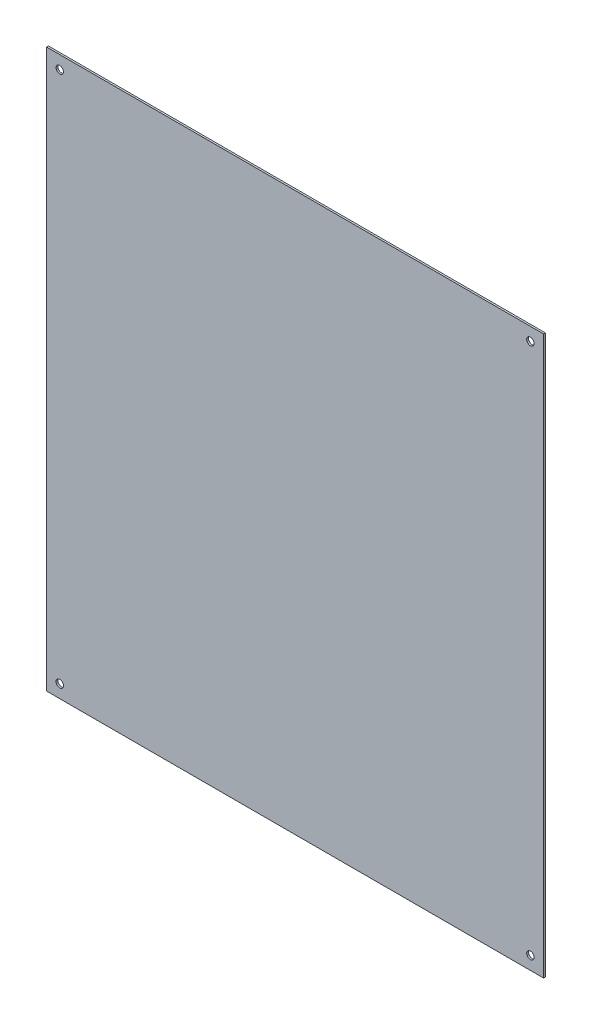
ISO-10303-21;
HEADER;
FILE_DESCRIPTION(('STEP AP214'),'2;1');
FILE_NAME('part.step','',(''),(''),'','','');
FILE_SCHEMA(('AUTOMOTIVE_DESIGN { 1 0 10303 214 1 1 1 1 }'));
ENDSEC;
DATA;
#1=APPLICATION_CONTEXT('core data for automotive mechanical design processes');
#2=APPLICATION_PROTOCOL_DEFINITION('international standard','automotive_design',2000,#1);
#3=PRODUCT_CONTEXT('',#1,'mechanical');
#4=PRODUCT('Part','Part','',(#3));
#5=PRODUCT_RELATED_PRODUCT_CATEGORY('part','',(#4));
#6=PRODUCT_DEFINITION_FORMATION('','',#4);
#7=PRODUCT_DEFINITION_CONTEXT('part definition',#1,'design');
#8=PRODUCT_DEFINITION('design','',#6,#7);
#9=PRODUCT_DEFINITION_SHAPE('','',#8);
#10=(LENGTH_UNIT() NAMED_UNIT(*) SI_UNIT(.MILLI.,.METRE.));
#11=(NAMED_UNIT(*) PLANE_ANGLE_UNIT() SI_UNIT($,.RADIAN.));
#12=(NAMED_UNIT(*) SI_UNIT($,.STERADIAN.) SOLID_ANGLE_UNIT());
#13=UNCERTAINTY_MEASURE_WITH_UNIT(LENGTH_MEASURE(1.E-05),#10,'distance_accuracy_value','');
#14=(GEOMETRIC_REPRESENTATION_CONTEXT(3) GLOBAL_UNCERTAINTY_ASSIGNED_CONTEXT((#13)) GLOBAL_UNIT_ASSIGNED_CONTEXT((#10,
#11,#12)) REPRESENTATION_CONTEXT('',''));
#15=CARTESIAN_POINT('',(0.,0.,0.));
#16=DIRECTION('',(0.,0.,1.));
#17=DIRECTION('',(1.,0.,0.));
#18=AXIS2_PLACEMENT_3D('',#15,#16,#17);
#19=CARTESIAN_POINT('',(-361.95,-406.4,11.557));
#20=DIRECTION('',(0.,0.,1.));
#21=DIRECTION('',(1.,0.,0.));
#22=AXIS2_PLACEMENT_3D('',#19,#20,#21);
#23=PLANE('',#22);
#24=CARTESIAN_POINT('',(-342.9,387.35,11.557));
#25=DIRECTION('',(0.,0.,1.));
#26=DIRECTION('',(1.,0.,0.));
#27=AXIS2_PLACEMENT_3D('',#24,#25,#26);
#28=CIRCLE('',#27,5.39750000000004);
#29=CARTESIAN_POINT('',(-337.5025,387.35,11.557));
#30=VERTEX_POINT('',#29);
#31=EDGE_CURVE('E91',#30,#30,#28,.T.);
#32=ORIENTED_EDGE('',*,*,#31,.T.);
#33=EDGE_LOOP('',(#32));
#34=FACE_BOUND('',#33,.T.);
#35=CARTESIAN_POINT('',(342.9,387.35,11.557));
#36=DIRECTION('',(0.,0.,1.));
#37=DIRECTION('',(1.,0.,0.));
#38=AXIS2_PLACEMENT_3D('',#35,#36,#37);
#39=CIRCLE('',#38,5.39750000000004);
#40=CARTESIAN_POINT('',(348.2975,387.35,11.557));
#41=VERTEX_POINT('',#40);
#42=EDGE_CURVE('E95',#41,#41,#39,.T.);
#43=ORIENTED_EDGE('',*,*,#42,.T.);
#44=EDGE_LOOP('',(#43));
#45=FACE_BOUND('',#44,.T.);
#46=CARTESIAN_POINT('',(342.9,-387.35,11.557));
#47=DIRECTION('',(0.,0.,1.));
#48=DIRECTION('',(1.,0.,0.));
#49=AXIS2_PLACEMENT_3D('',#46,#47,#48);
#50=CIRCLE('',#49,5.39750000000004);
#51=CARTESIAN_POINT('',(348.2975,-387.35,11.557));
#52=VERTEX_POINT('',#51);
#53=EDGE_CURVE('E97',#52,#52,#50,.T.);
#54=ORIENTED_EDGE('',*,*,#53,.T.);
#55=EDGE_LOOP('',(#54));
#56=FACE_BOUND('',#55,.T.);
#57=CARTESIAN_POINT('',(-342.9,-387.35,11.557));
#58=DIRECTION('',(0.,0.,1.));
#59=DIRECTION('',(1.,0.,0.));
#60=AXIS2_PLACEMENT_3D('',#57,#58,#59);
#61=CIRCLE('',#60,5.39750000000004);
#62=CARTESIAN_POINT('',(-337.5025,-387.35,11.557));
#63=VERTEX_POINT('',#62);
#64=EDGE_CURVE('E20',#63,#63,#61,.T.);
#65=ORIENTED_EDGE('',*,*,#64,.T.);
#66=EDGE_LOOP('',(#65));
#67=FACE_BOUND('',#66,.T.);
#68=DIRECTION('',(0.,1.,0.));
#69=VECTOR('',#68,1.);
#70=CARTESIAN_POINT('',(361.95,406.4,11.557));
#71=LINE('',#70,#69);
#72=CARTESIAN_POINT('',(361.95,406.4,11.557));
#73=VERTEX_POINT('',#72);
#74=CARTESIAN_POINT('',(361.95,-406.4,11.557));
#75=VERTEX_POINT('',#74);
#76=EDGE_CURVE('E57',#73,#75,#71,.F.);
#77=ORIENTED_EDGE('',*,*,#76,.T.);
#78=DIRECTION('',(1.,0.,0.));
#79=VECTOR('',#78,1.);
#80=CARTESIAN_POINT('',(-361.95,-406.4,11.557));
#81=LINE('',#80,#79);
#82=CARTESIAN_POINT('',(-361.95,-406.4,11.557));
#83=VERTEX_POINT('',#82);
#84=EDGE_CURVE('E59',#75,#83,#81,.F.);
#85=ORIENTED_EDGE('',*,*,#84,.T.);
#86=DIRECTION('',(0.,1.,0.));
#87=VECTOR('',#86,1.);
#88=CARTESIAN_POINT('',(-361.95,406.4,11.557));
#89=LINE('',#88,#87);
#90=CARTESIAN_POINT('',(-361.95,406.4,11.557));
#91=VERTEX_POINT('',#90);
#92=EDGE_CURVE('E105',#83,#91,#89,.T.);
#93=ORIENTED_EDGE('',*,*,#92,.T.);
#94=DIRECTION('',(1.,0.,0.));
#95=VECTOR('',#94,1.);
#96=CARTESIAN_POINT('',(-361.95,406.4,11.557));
#97=LINE('',#96,#95);
#98=EDGE_CURVE('E55',#91,#73,#97,.T.);
#99=ORIENTED_EDGE('',*,*,#98,.T.);
#100=EDGE_LOOP('',(#77,#85,#93,#99));
#101=FACE_BOUND('',#100,.T.);
#102=ADVANCED_FACE('F17',(#34,#45,#56,#67,#101),#23,.F.);
#103=CARTESIAN_POINT('',(-361.95,-406.4,14.224));
#104=DIRECTION('',(0.,1.,0.));
#105=DIRECTION('',(0.,0.,1.));
#106=AXIS2_PLACEMENT_3D('',#103,#104,#105);
#107=PLANE('',#106);
#108=DIRECTION('',(1.,0.,0.));
#109=VECTOR('',#108,1.);
#110=CARTESIAN_POINT('',(-361.95,-406.4,14.224));
#111=LINE('',#110,#109);
#112=CARTESIAN_POINT('',(-361.95,-406.4,14.224));
#113=VERTEX_POINT('',#112);
#114=CARTESIAN_POINT('',(361.95,-406.4,14.224));
#115=VERTEX_POINT('',#114);
#116=EDGE_CURVE('E94',#113,#115,#111,.T.);
#117=ORIENTED_EDGE('',*,*,#116,.F.);
#118=DIRECTION('',(0.,0.,-1.));
#119=VECTOR('',#118,1.);
#120=CARTESIAN_POINT('',(-361.95,-406.4,14.224));
#121=LINE('',#120,#119);
#122=EDGE_CURVE('E70',#113,#83,#121,.T.);
#123=ORIENTED_EDGE('',*,*,#122,.T.);
#124=ORIENTED_EDGE('',*,*,#84,.F.);
#125=DIRECTION('',(0.,0.,1.));
#126=VECTOR('',#125,1.);
#127=CARTESIAN_POINT('',(361.95,-406.4,14.224));
#128=LINE('',#127,#126);
#129=EDGE_CURVE('E64',#75,#115,#128,.T.);
#130=ORIENTED_EDGE('',*,*,#129,.T.);
#131=EDGE_LOOP('',(#117,#123,#124,#130));
#132=FACE_BOUND('',#131,.T.);
#133=ADVANCED_FACE('F67',(#132),#107,.F.);
#134=CARTESIAN_POINT('',(361.95,406.4,14.224));
#135=DIRECTION('',(-1.,0.,0.));
#136=DIRECTION('',(0.,0.,1.));
#137=AXIS2_PLACEMENT_3D('',#134,#135,#136);
#138=PLANE('',#137);
#139=DIRECTION('',(0.,1.,0.));
#140=VECTOR('',#139,1.);
#141=CARTESIAN_POINT('',(361.95,-406.4,14.224));
#142=LINE('',#141,#140);
#143=CARTESIAN_POINT('',(361.95,406.4,14.224));
#144=VERTEX_POINT('',#143);
#145=EDGE_CURVE('E75',#115,#144,#142,.T.);
#146=ORIENTED_EDGE('',*,*,#145,.F.);
#147=ORIENTED_EDGE('',*,*,#129,.F.);
#148=ORIENTED_EDGE('',*,*,#76,.F.);
#149=DIRECTION('',(0.,0.,-1.));
#150=VECTOR('',#149,1.);
#151=CARTESIAN_POINT('',(361.95,406.4,14.224));
#152=LINE('',#151,#150);
#153=EDGE_CURVE('E78',#73,#144,#152,.F.);
#154=ORIENTED_EDGE('',*,*,#153,.T.);
#155=EDGE_LOOP('',(#146,#147,#148,#154));
#156=FACE_BOUND('',#155,.T.);
#157=ADVANCED_FACE('F73',(#156),#138,.F.);
#158=CARTESIAN_POINT('',(-361.95,406.4,14.224));
#159=DIRECTION('',(0.,-1.,0.));
#160=DIRECTION('',(0.,0.,-1.));
#161=AXIS2_PLACEMENT_3D('',#158,#159,#160);
#162=PLANE('',#161);
#163=DIRECTION('',(1.,0.,0.));
#164=VECTOR('',#163,1.);
#165=CARTESIAN_POINT('',(-361.95,406.4,14.224));
#166=LINE('',#165,#164);
#167=CARTESIAN_POINT('',(-361.95,406.4,14.224));
#168=VERTEX_POINT('',#167);
#169=EDGE_CURVE('E111',#144,#168,#166,.F.);
#170=ORIENTED_EDGE('',*,*,#169,.F.);
#171=ORIENTED_EDGE('',*,*,#153,.F.);
#172=ORIENTED_EDGE('',*,*,#98,.F.);
#173=DIRECTION('',(0.,0.,-1.));
#174=VECTOR('',#173,1.);
#175=CARTESIAN_POINT('',(-361.95,406.4,14.224));
#176=LINE('',#175,#174);
#177=EDGE_CURVE('E35',#91,#168,#176,.F.);
#178=ORIENTED_EDGE('',*,*,#177,.T.);
#179=EDGE_LOOP('',(#170,#171,#172,#178));
#180=FACE_BOUND('',#179,.T.);
#181=ADVANCED_FACE('F112',(#180),#162,.F.);
#182=CARTESIAN_POINT('',(-361.95,406.4,14.224));
#183=DIRECTION('',(1.,0.,0.));
#184=DIRECTION('',(0.,0.,-1.));
#185=AXIS2_PLACEMENT_3D('',#182,#183,#184);
#186=PLANE('',#185);
#187=DIRECTION('',(0.,1.,0.));
#188=VECTOR('',#187,1.);
#189=CARTESIAN_POINT('',(-361.95,-406.4,14.224));
#190=LINE('',#189,#188);
#191=EDGE_CURVE('E90',#168,#113,#190,.F.);
#192=ORIENTED_EDGE('',*,*,#191,.F.);
#193=ORIENTED_EDGE('',*,*,#177,.F.);
#194=ORIENTED_EDGE('',*,*,#92,.F.);
#195=ORIENTED_EDGE('',*,*,#122,.F.);
#196=EDGE_LOOP('',(#192,#193,#194,#195));
#197=FACE_BOUND('',#196,.T.);
#198=ADVANCED_FACE('F119',(#197),#186,.F.);
#199=CARTESIAN_POINT('',(-342.9,-387.35,-0.00100000000001314));
#200=DIRECTION('',(0.,0.,1.));
#201=DIRECTION('',(1.,0.,0.));
#202=AXIS2_PLACEMENT_3D('',#199,#200,#201);
#203=CYLINDRICAL_SURFACE('',#202,5.39750000000004);
#204=ORIENTED_EDGE('',*,*,#64,.F.);
#205=EDGE_LOOP('',(#204));
#206=FACE_BOUND('',#205,.T.);
#207=CARTESIAN_POINT('',(-342.9,-387.35,14.224));
#208=DIRECTION('',(0.,0.,1.));
#209=DIRECTION('',(1.,0.,0.));
#210=AXIS2_PLACEMENT_3D('',#207,#208,#209);
#211=CIRCLE('',#210,5.39750000000004);
#212=CARTESIAN_POINT('',(-337.5025,-387.35,14.224));
#213=VERTEX_POINT('',#212);
#214=EDGE_CURVE('E87',#213,#213,#211,.F.);
#215=ORIENTED_EDGE('',*,*,#214,.F.);
#216=EDGE_LOOP('',(#215));
#217=FACE_BOUND('',#216,.T.);
#218=ADVANCED_FACE('F121',(#206,#217),#203,.F.);
#219=CARTESIAN_POINT('',(342.9,-387.35,-0.00100000000001314));
#220=DIRECTION('',(0.,0.,1.));
#221=DIRECTION('',(1.,0.,0.));
#222=AXIS2_PLACEMENT_3D('',#219,#220,#221);
#223=CYLINDRICAL_SURFACE('',#222,5.39750000000004);
#224=ORIENTED_EDGE('',*,*,#53,.F.);
#225=EDGE_LOOP('',(#224));
#226=FACE_BOUND('',#225,.T.);
#227=CARTESIAN_POINT('',(342.9,-387.35,14.224));
#228=DIRECTION('',(0.,0.,1.));
#229=DIRECTION('',(1.,0.,0.));
#230=AXIS2_PLACEMENT_3D('',#227,#228,#229);
#231=CIRCLE('',#230,5.39750000000004);
#232=CARTESIAN_POINT('',(348.2975,-387.35,14.224));
#233=VERTEX_POINT('',#232);
#234=EDGE_CURVE('E84',#233,#233,#231,.F.);
#235=ORIENTED_EDGE('',*,*,#234,.F.);
#236=EDGE_LOOP('',(#235));
#237=FACE_BOUND('',#236,.T.);
#238=ADVANCED_FACE('F128',(#226,#237),#223,.F.);
#239=CARTESIAN_POINT('',(342.9,387.35,-0.00100000000001314));
#240=DIRECTION('',(0.,0.,1.));
#241=DIRECTION('',(1.,0.,0.));
#242=AXIS2_PLACEMENT_3D('',#239,#240,#241);
#243=CYLINDRICAL_SURFACE('',#242,5.39750000000004);
#244=ORIENTED_EDGE('',*,*,#42,.F.);
#245=EDGE_LOOP('',(#244));
#246=FACE_BOUND('',#245,.T.);
#247=CARTESIAN_POINT('',(342.9,387.35,14.224));
#248=DIRECTION('',(0.,0.,1.));
#249=DIRECTION('',(1.,0.,0.));
#250=AXIS2_PLACEMENT_3D('',#247,#248,#249);
#251=CIRCLE('',#250,5.39750000000004);
#252=CARTESIAN_POINT('',(348.2975,387.35,14.224));
#253=VERTEX_POINT('',#252);
#254=EDGE_CURVE('E26',#253,#253,#251,.F.);
#255=ORIENTED_EDGE('',*,*,#254,.F.);
#256=EDGE_LOOP('',(#255));
#257=FACE_BOUND('',#256,.T.);
#258=ADVANCED_FACE('F139',(#246,#257),#243,.F.);
#259=CARTESIAN_POINT('',(-342.9,387.35,-0.00100000000001314));
#260=DIRECTION('',(0.,0.,1.));
#261=DIRECTION('',(1.,0.,0.));
#262=AXIS2_PLACEMENT_3D('',#259,#260,#261);
#263=CYLINDRICAL_SURFACE('',#262,5.39750000000004);
#264=ORIENTED_EDGE('',*,*,#31,.F.);
#265=EDGE_LOOP('',(#264));
#266=FACE_BOUND('',#265,.T.);
#267=CARTESIAN_POINT('',(-342.9,387.35,14.224));
#268=DIRECTION('',(0.,0.,1.));
#269=DIRECTION('',(1.,0.,0.));
#270=AXIS2_PLACEMENT_3D('',#267,#268,#269);
#271=CIRCLE('',#270,5.39750000000004);
#272=CARTESIAN_POINT('',(-337.5025,387.35,14.224));
#273=VERTEX_POINT('',#272);
#274=EDGE_CURVE('E11',#273,#273,#271,.F.);
#275=ORIENTED_EDGE('',*,*,#274,.F.);
#276=EDGE_LOOP('',(#275));
#277=FACE_BOUND('',#276,.T.);
#278=ADVANCED_FACE('F133',(#266,#277),#263,.F.);
#279=CARTESIAN_POINT('',(-361.95,-406.4,14.224));
#280=DIRECTION('',(0.,0.,1.));
#281=DIRECTION('',(1.,0.,0.));
#282=AXIS2_PLACEMENT_3D('',#279,#280,#281);
#283=PLANE('',#282);
#284=ORIENTED_EDGE('',*,*,#274,.T.);
#285=EDGE_LOOP('',(#284));
#286=FACE_BOUND('',#285,.T.);
#287=ORIENTED_EDGE('',*,*,#254,.T.);
#288=EDGE_LOOP('',(#287));
#289=FACE_BOUND('',#288,.T.);
#290=ORIENTED_EDGE('',*,*,#234,.T.);
#291=EDGE_LOOP('',(#290));
#292=FACE_BOUND('',#291,.T.);
#293=ORIENTED_EDGE('',*,*,#214,.T.);
#294=EDGE_LOOP('',(#293));
#295=FACE_BOUND('',#294,.T.);
#296=ORIENTED_EDGE('',*,*,#169,.T.);
#297=ORIENTED_EDGE('',*,*,#191,.T.);
#298=ORIENTED_EDGE('',*,*,#116,.T.);
#299=ORIENTED_EDGE('',*,*,#145,.T.);
#300=EDGE_LOOP('',(#296,#297,#298,#299));
#301=FACE_BOUND('',#300,.T.);
#302=ADVANCED_FACE('F116',(#286,#289,#292,#295,#301),#283,.T.);
#303=CLOSED_SHELL('',(#102,#133,#157,#181,#198,#218,#238,#258,#278,#302));
#304=MANIFOLD_SOLID_BREP('B1',#303);
#305=ADVANCED_BREP_SHAPE_REPRESENTATION('',(#18,#304),#14);
#306=SHAPE_DEFINITION_REPRESENTATION(#9,#305);
ENDSEC;
END-ISO-10303-21;
